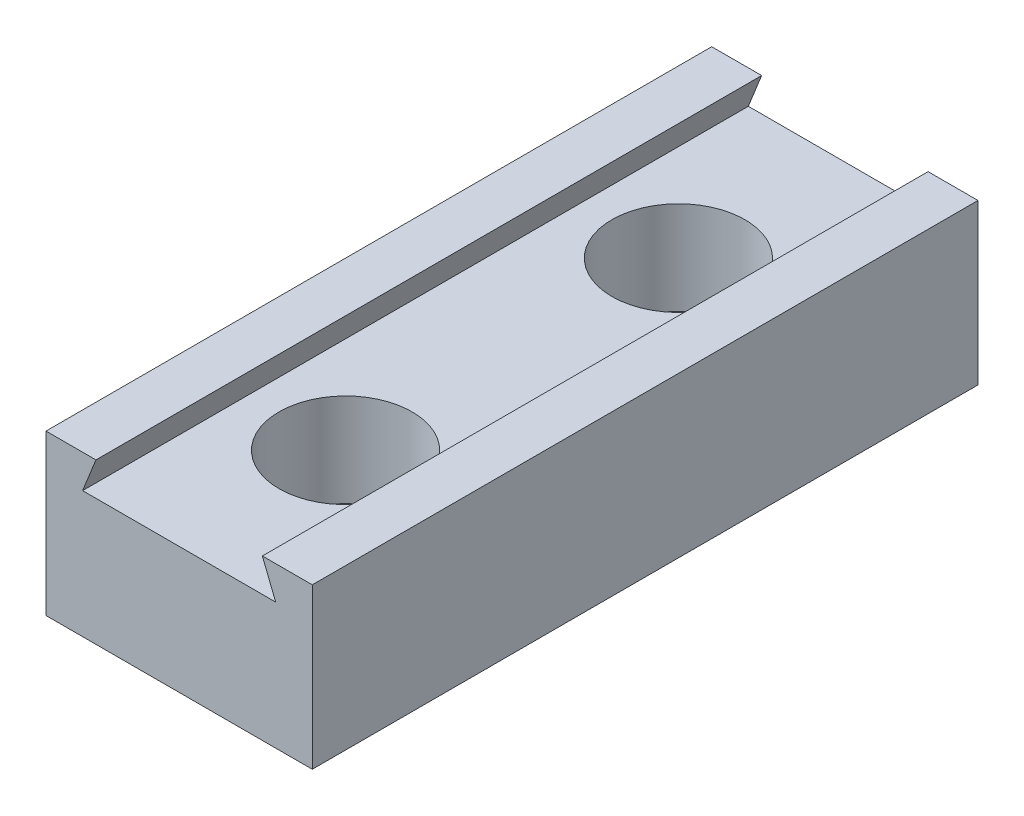
ISO-10303-21;
HEADER;
FILE_DESCRIPTION(('STEP AP214'),'2;1');
FILE_NAME('part.step','',(''),(''),'','','');
FILE_SCHEMA(('AUTOMOTIVE_DESIGN { 1 0 10303 214 1 1 1 1 }'));
ENDSEC;
DATA;
#1=APPLICATION_CONTEXT('core data for automotive mechanical design processes');
#2=APPLICATION_PROTOCOL_DEFINITION('international standard','automotive_design',2000,#1);
#3=PRODUCT_CONTEXT('',#1,'mechanical');
#4=PRODUCT('Part','Part','',(#3));
#5=PRODUCT_RELATED_PRODUCT_CATEGORY('part','',(#4));
#6=PRODUCT_DEFINITION_FORMATION('','',#4);
#7=PRODUCT_DEFINITION_CONTEXT('part definition',#1,'design');
#8=PRODUCT_DEFINITION('design','',#6,#7);
#9=PRODUCT_DEFINITION_SHAPE('','',#8);
#10=(LENGTH_UNIT() NAMED_UNIT(*) SI_UNIT(.MILLI.,.METRE.));
#11=(NAMED_UNIT(*) PLANE_ANGLE_UNIT() SI_UNIT($,.RADIAN.));
#12=(NAMED_UNIT(*) SI_UNIT($,.STERADIAN.) SOLID_ANGLE_UNIT());
#13=UNCERTAINTY_MEASURE_WITH_UNIT(LENGTH_MEASURE(1.E-05),#10,'distance_accuracy_value','');
#14=(GEOMETRIC_REPRESENTATION_CONTEXT(3) GLOBAL_UNCERTAINTY_ASSIGNED_CONTEXT((#13)) GLOBAL_UNIT_ASSIGNED_CONTEXT((#10,
#11,#12)) REPRESENTATION_CONTEXT('',''));
#15=CARTESIAN_POINT('',(0.,0.,0.));
#16=DIRECTION('',(0.,0.,1.));
#17=DIRECTION('',(1.,0.,0.));
#18=AXIS2_PLACEMENT_3D('',#15,#16,#17);
#19=CARTESIAN_POINT('',(0.,12.,0.));
#20=DIRECTION('',(0.,-1.,0.));
#21=DIRECTION('',(0.,0.,-1.));
#22=AXIS2_PLACEMENT_3D('',#19,#20,#21);
#23=PLANE('',#22);
#24=DIRECTION('',(-1.,0.,0.));
#25=VECTOR('',#24,1.);
#26=CARTESIAN_POINT('',(-10.,12.,-25.));
#27=LINE('',#26,#25);
#28=CARTESIAN_POINT('',(10.,12.,-25.));
#29=VERTEX_POINT('',#28);
#30=CARTESIAN_POINT('',(6.25,12.,-25.));
#31=VERTEX_POINT('',#30);
#32=EDGE_CURVE('E93',#29,#31,#27,.T.);
#33=ORIENTED_EDGE('',*,*,#32,.T.);
#34=DIRECTION('',(0.,0.,1.));
#35=VECTOR('',#34,1.);
#36=CARTESIAN_POINT('',(6.25,12.,-25.001));
#37=LINE('',#36,#35);
#38=CARTESIAN_POINT('',(6.25,12.,25.));
#39=VERTEX_POINT('',#38);
#40=EDGE_CURVE('E181',#31,#39,#37,.T.);
#41=ORIENTED_EDGE('',*,*,#40,.T.);
#42=DIRECTION('',(1.,0.,0.));
#43=VECTOR('',#42,1.);
#44=CARTESIAN_POINT('',(-10.,12.,25.));
#45=LINE('',#44,#43);
#46=CARTESIAN_POINT('',(10.,12.,25.));
#47=VERTEX_POINT('',#46);
#48=EDGE_CURVE('E64',#39,#47,#45,.T.);
#49=ORIENTED_EDGE('',*,*,#48,.T.);
#50=DIRECTION('',(0.,0.,-1.));
#51=VECTOR('',#50,1.);
#52=CARTESIAN_POINT('',(10.,12.,25.));
#53=LINE('',#52,#51);
#54=EDGE_CURVE('E160',#47,#29,#53,.T.);
#55=ORIENTED_EDGE('',*,*,#54,.T.);
#56=EDGE_LOOP('',(#33,#41,#49,#55));
#57=FACE_BOUND('',#56,.T.);
#58=ADVANCED_FACE('F39',(#57),#23,.F.);
#59=CARTESIAN_POINT('',(10.,12.,25.));
#60=DIRECTION('',(-1.,0.,0.));
#61=DIRECTION('',(0.,0.,1.));
#62=AXIS2_PLACEMENT_3D('',#59,#60,#61);
#63=PLANE('',#62);
#64=DIRECTION('',(0.,0.,-1.));
#65=VECTOR('',#64,1.);
#66=CARTESIAN_POINT('',(10.,0.,25.));
#67=LINE('',#66,#65);
#68=CARTESIAN_POINT('',(10.,0.,25.));
#69=VERTEX_POINT('',#68);
#70=CARTESIAN_POINT('',(10.,0.,-25.));
#71=VERTEX_POINT('',#70);
#72=EDGE_CURVE('E149',#69,#71,#67,.T.);
#73=ORIENTED_EDGE('',*,*,#72,.T.);
#74=DIRECTION('',(0.,-1.,0.));
#75=VECTOR('',#74,1.);
#76=CARTESIAN_POINT('',(10.,12.,-25.));
#77=LINE('',#76,#75);
#78=EDGE_CURVE('E11',#29,#71,#77,.T.);
#79=ORIENTED_EDGE('',*,*,#78,.F.);
#80=ORIENTED_EDGE('',*,*,#54,.F.);
#81=DIRECTION('',(0.,-1.,0.));
#82=VECTOR('',#81,1.);
#83=CARTESIAN_POINT('',(10.,12.,25.));
#84=LINE('',#83,#82);
#85=EDGE_CURVE('E140',#47,#69,#84,.T.);
#86=ORIENTED_EDGE('',*,*,#85,.T.);
#87=EDGE_LOOP('',(#73,#79,#80,#86));
#88=FACE_BOUND('',#87,.T.);
#89=ADVANCED_FACE('F41',(#88),#63,.F.);
#90=CARTESIAN_POINT('',(-10.,12.,-25.));
#91=DIRECTION('',(0.,0.,1.));
#92=DIRECTION('',(1.,0.,0.));
#93=AXIS2_PLACEMENT_3D('',#90,#91,#92);
#94=PLANE('',#93);
#95=DIRECTION('',(-1.,0.,0.));
#96=VECTOR('',#95,1.);
#97=CARTESIAN_POINT('',(0.,9.5,-25.));
#98=LINE('',#97,#96);
#99=CARTESIAN_POINT('',(7.25,9.5,-25.));
#100=VERTEX_POINT('',#99);
#101=CARTESIAN_POINT('',(-7.25,9.5,-25.));
#102=VERTEX_POINT('',#101);
#103=EDGE_CURVE('E199',#100,#102,#98,.T.);
#104=ORIENTED_EDGE('',*,*,#103,.F.);
#105=DIRECTION('',(0.371390676354104,-0.928476690885259,0.));
#106=VECTOR('',#105,1.);
#107=CARTESIAN_POINT('',(6.25,12.,-25.));
#108=LINE('',#107,#106);
#109=EDGE_CURVE('E133',#31,#100,#108,.T.);
#110=ORIENTED_EDGE('',*,*,#109,.F.);
#111=ORIENTED_EDGE('',*,*,#32,.F.);
#112=ORIENTED_EDGE('',*,*,#78,.T.);
#113=DIRECTION('',(-1.,0.,0.));
#114=VECTOR('',#113,1.);
#115=CARTESIAN_POINT('',(-10.,0.,-25.));
#116=LINE('',#115,#114);
#117=CARTESIAN_POINT('',(-10.,0.,-25.));
#118=VERTEX_POINT('',#117);
#119=EDGE_CURVE('E153',#71,#118,#116,.T.);
#120=ORIENTED_EDGE('',*,*,#119,.T.);
#121=DIRECTION('',(0.,-1.,0.));
#122=VECTOR('',#121,1.);
#123=CARTESIAN_POINT('',(-10.,12.,-25.));
#124=LINE('',#123,#122);
#125=CARTESIAN_POINT('',(-10.,12.,-25.));
#126=VERTEX_POINT('',#125);
#127=EDGE_CURVE('E48',#126,#118,#124,.T.);
#128=ORIENTED_EDGE('',*,*,#127,.F.);
#129=CARTESIAN_POINT('',(-6.25,12.,-25.));
#130=VERTEX_POINT('',#129);
#131=EDGE_CURVE('E192',#130,#126,#27,.T.);
#132=ORIENTED_EDGE('',*,*,#131,.F.);
#133=DIRECTION('',(0.371390676354103,0.928476690885259,0.));
#134=VECTOR('',#133,1.);
#135=CARTESIAN_POINT('',(-7.25,9.5,-25.));
#136=LINE('',#135,#134);
#137=EDGE_CURVE('E55',#102,#130,#136,.T.);
#138=ORIENTED_EDGE('',*,*,#137,.F.);
#139=EDGE_LOOP('',(#104,#110,#111,#112,#120,#128,#132,#138));
#140=FACE_BOUND('',#139,.T.);
#141=ADVANCED_FACE('F197',(#140),#94,.F.);
#142=CARTESIAN_POINT('',(-10.,12.,25.));
#143=DIRECTION('',(1.,0.,0.));
#144=DIRECTION('',(0.,0.,-1.));
#145=AXIS2_PLACEMENT_3D('',#142,#143,#144);
#146=PLANE('',#145);
#147=DIRECTION('',(0.,0.,1.));
#148=VECTOR('',#147,1.);
#149=CARTESIAN_POINT('',(-10.,0.,25.));
#150=LINE('',#149,#148);
#151=CARTESIAN_POINT('',(-10.,0.,25.));
#152=VERTEX_POINT('',#151);
#153=EDGE_CURVE('E156',#118,#152,#150,.T.);
#154=ORIENTED_EDGE('',*,*,#153,.T.);
#155=DIRECTION('',(0.,-1.,0.));
#156=VECTOR('',#155,1.);
#157=CARTESIAN_POINT('',(-10.,12.,25.));
#158=LINE('',#157,#156);
#159=CARTESIAN_POINT('',(-10.,12.,25.));
#160=VERTEX_POINT('',#159);
#161=EDGE_CURVE('E144',#160,#152,#158,.T.);
#162=ORIENTED_EDGE('',*,*,#161,.F.);
#163=DIRECTION('',(0.,0.,1.));
#164=VECTOR('',#163,1.);
#165=CARTESIAN_POINT('',(-10.,12.,25.));
#166=LINE('',#165,#164);
#167=EDGE_CURVE('E137',#126,#160,#166,.T.);
#168=ORIENTED_EDGE('',*,*,#167,.F.);
#169=ORIENTED_EDGE('',*,*,#127,.T.);
#170=EDGE_LOOP('',(#154,#162,#168,#169));
#171=FACE_BOUND('',#170,.T.);
#172=ADVANCED_FACE('F168',(#171),#146,.F.);
#173=CARTESIAN_POINT('',(-10.,12.,25.));
#174=DIRECTION('',(0.,0.,-1.));
#175=DIRECTION('',(-1.,0.,0.));
#176=AXIS2_PLACEMENT_3D('',#173,#174,#175);
#177=PLANE('',#176);
#178=ORIENTED_EDGE('',*,*,#48,.F.);
#179=DIRECTION('',(-0.371390676354104,0.928476690885259,0.));
#180=VECTOR('',#179,1.);
#181=CARTESIAN_POINT('',(6.25,12.,25.));
#182=LINE('',#181,#180);
#183=CARTESIAN_POINT('',(7.25,9.5,25.));
#184=VERTEX_POINT('',#183);
#185=EDGE_CURVE('E124',#184,#39,#182,.T.);
#186=ORIENTED_EDGE('',*,*,#185,.F.);
#187=DIRECTION('',(1.,0.,0.));
#188=VECTOR('',#187,1.);
#189=CARTESIAN_POINT('',(0.,9.5,25.));
#190=LINE('',#189,#188);
#191=CARTESIAN_POINT('',(-7.25,9.5,25.));
#192=VERTEX_POINT('',#191);
#193=EDGE_CURVE('E131',#192,#184,#190,.T.);
#194=ORIENTED_EDGE('',*,*,#193,.F.);
#195=DIRECTION('',(-0.371390676354103,-0.928476690885259,0.));
#196=VECTOR('',#195,1.);
#197=CARTESIAN_POINT('',(-7.25,9.5,25.));
#198=LINE('',#197,#196);
#199=CARTESIAN_POINT('',(-6.25,12.,25.));
#200=VERTEX_POINT('',#199);
#201=EDGE_CURVE('E117',#200,#192,#198,.T.);
#202=ORIENTED_EDGE('',*,*,#201,.F.);
#203=EDGE_CURVE('E128',#160,#200,#45,.T.);
#204=ORIENTED_EDGE('',*,*,#203,.F.);
#205=ORIENTED_EDGE('',*,*,#161,.T.);
#206=DIRECTION('',(1.,0.,0.));
#207=VECTOR('',#206,1.);
#208=CARTESIAN_POINT('',(-10.,0.,25.));
#209=LINE('',#208,#207);
#210=EDGE_CURVE('E86',#152,#69,#209,.T.);
#211=ORIENTED_EDGE('',*,*,#210,.T.);
#212=ORIENTED_EDGE('',*,*,#85,.F.);
#213=EDGE_LOOP('',(#178,#186,#194,#202,#204,#205,#211,#212));
#214=FACE_BOUND('',#213,.T.);
#215=ADVANCED_FACE('F127',(#214),#177,.F.);
#216=ORIENTED_EDGE('',*,*,#203,.T.);
#217=DIRECTION('',(0.,0.,1.));
#218=VECTOR('',#217,1.);
#219=CARTESIAN_POINT('',(-6.25,12.,-25.001));
#220=LINE('',#219,#218);
#221=EDGE_CURVE('E114',#130,#200,#220,.T.);
#222=ORIENTED_EDGE('',*,*,#221,.F.);
#223=ORIENTED_EDGE('',*,*,#131,.T.);
#224=ORIENTED_EDGE('',*,*,#167,.T.);
#225=EDGE_LOOP('',(#216,#222,#223,#224));
#226=FACE_BOUND('',#225,.T.);
#227=ADVANCED_FACE('F135',(#226),#23,.F.);
#228=CARTESIAN_POINT('',(0.,0.,0.));
#229=DIRECTION('',(0.,-1.,0.));
#230=DIRECTION('',(0.,0.,-1.));
#231=AXIS2_PLACEMENT_3D('',#228,#229,#230);
#232=PLANE('',#231);
#233=CARTESIAN_POINT('',(0.,0.,-12.5));
#234=DIRECTION('',(0.,-1.,0.));
#235=DIRECTION('',(0.,0.,-1.));
#236=AXIS2_PLACEMENT_3D('',#233,#234,#235);
#237=CIRCLE('',#236,2.25);
#238=CARTESIAN_POINT('',(0.,0.,-14.75));
#239=VERTEX_POINT('',#238);
#240=EDGE_CURVE('E232',#239,#239,#237,.F.);
#241=ORIENTED_EDGE('',*,*,#240,.T.);
#242=EDGE_LOOP('',(#241));
#243=FACE_BOUND('',#242,.T.);
#244=CARTESIAN_POINT('',(0.,0.,12.5));
#245=DIRECTION('',(0.,-1.,0.));
#246=DIRECTION('',(0.,0.,-1.));
#247=AXIS2_PLACEMENT_3D('',#244,#245,#246);
#248=CIRCLE('',#247,2.25);
#249=CARTESIAN_POINT('',(0.,0.,10.25));
#250=VERTEX_POINT('',#249);
#251=EDGE_CURVE('E224',#250,#250,#248,.F.);
#252=ORIENTED_EDGE('',*,*,#251,.T.);
#253=EDGE_LOOP('',(#252));
#254=FACE_BOUND('',#253,.T.);
#255=ORIENTED_EDGE('',*,*,#72,.F.);
#256=ORIENTED_EDGE('',*,*,#210,.F.);
#257=ORIENTED_EDGE('',*,*,#153,.F.);
#258=ORIENTED_EDGE('',*,*,#119,.F.);
#259=EDGE_LOOP('',(#255,#256,#257,#258));
#260=FACE_BOUND('',#259,.T.);
#261=ADVANCED_FACE('F171',(#243,#254,#260),#232,.T.);
#262=CARTESIAN_POINT('',(6.25,12.,-25.001));
#263=DIRECTION('',(0.928476690885259,0.371390676354104,0.));
#264=DIRECTION('',(-0.371390676354104,0.928476690885259,0.));
#265=AXIS2_PLACEMENT_3D('',#262,#263,#264);
#266=PLANE('',#265);
#267=ORIENTED_EDGE('',*,*,#109,.T.);
#268=DIRECTION('',(0.,0.,1.));
#269=VECTOR('',#268,1.);
#270=CARTESIAN_POINT('',(7.25,9.5,-25.001));
#271=LINE('',#270,#269);
#272=EDGE_CURVE('E184',#100,#184,#271,.T.);
#273=ORIENTED_EDGE('',*,*,#272,.T.);
#274=ORIENTED_EDGE('',*,*,#185,.T.);
#275=ORIENTED_EDGE('',*,*,#40,.F.);
#276=EDGE_LOOP('',(#267,#273,#274,#275));
#277=FACE_BOUND('',#276,.T.);
#278=ADVANCED_FACE('F257',(#277),#266,.F.);
#279=CARTESIAN_POINT('',(0.,9.5,-25.001));
#280=DIRECTION('',(0.,-1.,0.));
#281=DIRECTION('',(0.,0.,-1.));
#282=AXIS2_PLACEMENT_3D('',#279,#280,#281);
#283=PLANE('',#282);
#284=CARTESIAN_POINT('',(0.,9.5,12.5));
#285=DIRECTION('',(0.,1.,0.));
#286=DIRECTION('',(0.,0.,1.));
#287=AXIS2_PLACEMENT_3D('',#284,#285,#286);
#288=CIRCLE('',#287,5.);
#289=CARTESIAN_POINT('',(0.,9.5,17.5));
#290=VERTEX_POINT('',#289);
#291=EDGE_CURVE('E209',#290,#290,#288,.T.);
#292=ORIENTED_EDGE('',*,*,#291,.F.);
#293=EDGE_LOOP('',(#292));
#294=FACE_BOUND('',#293,.T.);
#295=CARTESIAN_POINT('',(0.,9.5,-12.5));
#296=DIRECTION('',(0.,1.,0.));
#297=DIRECTION('',(0.,0.,1.));
#298=AXIS2_PLACEMENT_3D('',#295,#296,#297);
#299=CIRCLE('',#298,5.);
#300=CARTESIAN_POINT('',(0.,9.5,-7.5));
#301=VERTEX_POINT('',#300);
#302=EDGE_CURVE('E212',#301,#301,#299,.T.);
#303=ORIENTED_EDGE('',*,*,#302,.F.);
#304=EDGE_LOOP('',(#303));
#305=FACE_BOUND('',#304,.T.);
#306=ORIENTED_EDGE('',*,*,#103,.T.);
#307=DIRECTION('',(0.,0.,1.));
#308=VECTOR('',#307,1.);
#309=CARTESIAN_POINT('',(-7.25,9.5,-25.001));
#310=LINE('',#309,#308);
#311=EDGE_CURVE('E123',#102,#192,#310,.T.);
#312=ORIENTED_EDGE('',*,*,#311,.T.);
#313=ORIENTED_EDGE('',*,*,#193,.T.);
#314=ORIENTED_EDGE('',*,*,#272,.F.);
#315=EDGE_LOOP('',(#306,#312,#313,#314));
#316=FACE_BOUND('',#315,.T.);
#317=ADVANCED_FACE('F255',(#294,#305,#316),#283,.F.);
#318=CARTESIAN_POINT('',(-7.25,9.5,-25.001));
#319=DIRECTION('',(-0.928476690885259,0.371390676354103,0.));
#320=DIRECTION('',(-0.371390676354103,-0.928476690885259,0.));
#321=AXIS2_PLACEMENT_3D('',#318,#319,#320);
#322=PLANE('',#321);
#323=ORIENTED_EDGE('',*,*,#137,.T.);
#324=ORIENTED_EDGE('',*,*,#221,.T.);
#325=ORIENTED_EDGE('',*,*,#201,.T.);
#326=ORIENTED_EDGE('',*,*,#311,.F.);
#327=EDGE_LOOP('',(#323,#324,#325,#326));
#328=FACE_BOUND('',#327,.T.);
#329=ADVANCED_FACE('F116',(#328),#322,.F.);
#330=CARTESIAN_POINT('',(0.,2.5,-12.5));
#331=DIRECTION('',(0.,1.,0.));
#332=DIRECTION('',(0.,0.,1.));
#333=AXIS2_PLACEMENT_3D('',#330,#331,#332);
#334=CYLINDRICAL_SURFACE('',#333,5.);
#335=CARTESIAN_POINT('',(0.,2.5,-12.5));
#336=DIRECTION('',(0.,1.,0.));
#337=DIRECTION('',(0.,0.,1.));
#338=AXIS2_PLACEMENT_3D('',#335,#336,#337);
#339=CIRCLE('',#338,5.);
#340=CARTESIAN_POINT('',(0.,2.5,-7.5));
#341=VERTEX_POINT('',#340);
#342=EDGE_CURVE('E216',#341,#341,#339,.T.);
#343=ORIENTED_EDGE('',*,*,#342,.F.);
#344=EDGE_LOOP('',(#343));
#345=FACE_BOUND('',#344,.T.);
#346=ORIENTED_EDGE('',*,*,#302,.T.);
#347=EDGE_LOOP('',(#346));
#348=FACE_BOUND('',#347,.T.);
#349=ADVANCED_FACE('F246',(#345,#348),#334,.F.);
#350=CARTESIAN_POINT('',(0.,2.5,-12.5));
#351=DIRECTION('',(0.,1.,0.));
#352=DIRECTION('',(0.,0.,1.));
#353=AXIS2_PLACEMENT_3D('',#350,#351,#352);
#354=PLANE('',#353);
#355=CARTESIAN_POINT('',(0.,2.5,-12.5));
#356=DIRECTION('',(0.,1.,0.));
#357=DIRECTION('',(0.,0.,1.));
#358=AXIS2_PLACEMENT_3D('',#355,#356,#357);
#359=CIRCLE('',#358,2.25);
#360=CARTESIAN_POINT('',(0.,2.5,-10.25));
#361=VERTEX_POINT('',#360);
#362=EDGE_CURVE('E217',#361,#361,#359,.T.);
#363=ORIENTED_EDGE('',*,*,#362,.F.);
#364=EDGE_LOOP('',(#363));
#365=FACE_BOUND('',#364,.T.);
#366=ORIENTED_EDGE('',*,*,#342,.T.);
#367=EDGE_LOOP('',(#366));
#368=FACE_BOUND('',#367,.T.);
#369=ADVANCED_FACE('F242',(#365,#368),#354,.T.);
#370=CARTESIAN_POINT('',(0.,2.5,12.5));
#371=DIRECTION('',(0.,1.,0.));
#372=DIRECTION('',(0.,0.,1.));
#373=AXIS2_PLACEMENT_3D('',#370,#371,#372);
#374=CYLINDRICAL_SURFACE('',#373,5.);
#375=CARTESIAN_POINT('',(0.,2.5,12.5));
#376=DIRECTION('',(0.,1.,0.));
#377=DIRECTION('',(0.,0.,1.));
#378=AXIS2_PLACEMENT_3D('',#375,#376,#377);
#379=CIRCLE('',#378,5.);
#380=CARTESIAN_POINT('',(0.,2.5,17.5));
#381=VERTEX_POINT('',#380);
#382=EDGE_CURVE('E203',#381,#381,#379,.T.);
#383=ORIENTED_EDGE('',*,*,#382,.F.);
#384=EDGE_LOOP('',(#383));
#385=FACE_BOUND('',#384,.T.);
#386=ORIENTED_EDGE('',*,*,#291,.T.);
#387=EDGE_LOOP('',(#386));
#388=FACE_BOUND('',#387,.T.);
#389=ADVANCED_FACE('F245',(#385,#388),#374,.F.);
#390=CARTESIAN_POINT('',(0.,2.5,12.5));
#391=DIRECTION('',(0.,1.,0.));
#392=DIRECTION('',(0.,0.,1.));
#393=AXIS2_PLACEMENT_3D('',#390,#391,#392);
#394=PLANE('',#393);
#395=CARTESIAN_POINT('',(0.,2.5,12.5));
#396=DIRECTION('',(0.,1.,0.));
#397=DIRECTION('',(0.,0.,1.));
#398=AXIS2_PLACEMENT_3D('',#395,#396,#397);
#399=CIRCLE('',#398,2.25);
#400=CARTESIAN_POINT('',(0.,2.5,14.75));
#401=VERTEX_POINT('',#400);
#402=EDGE_CURVE('E228',#401,#401,#399,.T.);
#403=ORIENTED_EDGE('',*,*,#402,.F.);
#404=EDGE_LOOP('',(#403));
#405=FACE_BOUND('',#404,.T.);
#406=ORIENTED_EDGE('',*,*,#382,.T.);
#407=EDGE_LOOP('',(#406));
#408=FACE_BOUND('',#407,.T.);
#409=ADVANCED_FACE('F343',(#405,#408),#394,.T.);
#410=CARTESIAN_POINT('',(0.,-0.00100000000000013,12.5));
#411=DIRECTION('',(0.,1.,0.));
#412=DIRECTION('',(0.,0.,1.));
#413=AXIS2_PLACEMENT_3D('',#410,#411,#412);
#414=CYLINDRICAL_SURFACE('',#413,2.25);
#415=ORIENTED_EDGE('',*,*,#251,.F.);
#416=EDGE_LOOP('',(#415));
#417=FACE_BOUND('',#416,.T.);
#418=ORIENTED_EDGE('',*,*,#402,.T.);
#419=EDGE_LOOP('',(#418));
#420=FACE_BOUND('',#419,.T.);
#421=ADVANCED_FACE('F351',(#417,#420),#414,.F.);
#422=CARTESIAN_POINT('',(0.,-0.00100000000000013,-12.5));
#423=DIRECTION('',(0.,1.,0.));
#424=DIRECTION('',(0.,0.,1.));
#425=AXIS2_PLACEMENT_3D('',#422,#423,#424);
#426=CYLINDRICAL_SURFACE('',#425,2.25);
#427=ORIENTED_EDGE('',*,*,#240,.F.);
#428=EDGE_LOOP('',(#427));
#429=FACE_BOUND('',#428,.T.);
#430=ORIENTED_EDGE('',*,*,#362,.T.);
#431=EDGE_LOOP('',(#430));
#432=FACE_BOUND('',#431,.T.);
#433=ADVANCED_FACE('F240',(#429,#432),#426,.F.);
#434=CLOSED_SHELL('',(#58,#89,#141,#172,#215,#227,#261,#278,#317,#329,#349,#369,#389,#409,#421,#433));
#435=MANIFOLD_SOLID_BREP('B2',#434);
#436=ADVANCED_BREP_SHAPE_REPRESENTATION('',(#18,#435),#14);
#437=SHAPE_DEFINITION_REPRESENTATION(#9,#436);
ENDSEC;
END-ISO-10303-21;
